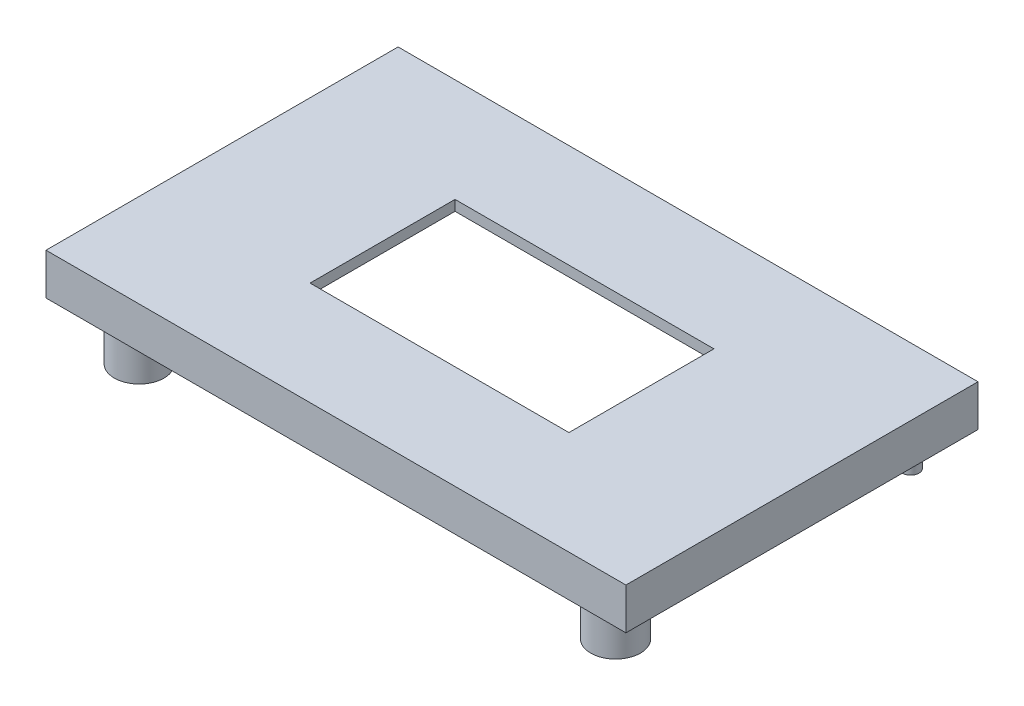
ISO-10303-21;
HEADER;
FILE_DESCRIPTION(('STEP AP214'),'2;1');
FILE_NAME('part.step','',(''),(''),'','','');
FILE_SCHEMA(('AUTOMOTIVE_DESIGN { 1 0 10303 214 1 1 1 1 }'));
ENDSEC;
DATA;
#1=APPLICATION_CONTEXT('core data for automotive mechanical design processes');
#2=APPLICATION_PROTOCOL_DEFINITION('international standard','automotive_design',2000,#1);
#3=PRODUCT_CONTEXT('',#1,'mechanical');
#4=PRODUCT('Part','Part','',(#3));
#5=PRODUCT_RELATED_PRODUCT_CATEGORY('part','',(#4));
#6=PRODUCT_DEFINITION_FORMATION('','',#4);
#7=PRODUCT_DEFINITION_CONTEXT('part definition',#1,'design');
#8=PRODUCT_DEFINITION('design','',#6,#7);
#9=PRODUCT_DEFINITION_SHAPE('','',#8);
#10=(LENGTH_UNIT() NAMED_UNIT(*) SI_UNIT(.MILLI.,.METRE.));
#11=(NAMED_UNIT(*) PLANE_ANGLE_UNIT() SI_UNIT($,.RADIAN.));
#12=(NAMED_UNIT(*) SI_UNIT($,.STERADIAN.) SOLID_ANGLE_UNIT());
#13=UNCERTAINTY_MEASURE_WITH_UNIT(LENGTH_MEASURE(1.E-05),#10,'distance_accuracy_value','');
#14=(GEOMETRIC_REPRESENTATION_CONTEXT(3) GLOBAL_UNCERTAINTY_ASSIGNED_CONTEXT((#13)) GLOBAL_UNIT_ASSIGNED_CONTEXT((#10,
#11,#12)) REPRESENTATION_CONTEXT('',''));
#15=CARTESIAN_POINT('',(0.,0.,0.));
#16=DIRECTION('',(0.,0.,1.));
#17=DIRECTION('',(1.,0.,0.));
#18=AXIS2_PLACEMENT_3D('',#15,#16,#17);
#19=CARTESIAN_POINT('',(-21.168,3.,0.));
#20=DIRECTION('',(1.,0.,0.));
#21=DIRECTION('',(0.,0.,-1.));
#22=AXIS2_PLACEMENT_3D('',#19,#20,#21);
#23=PLANE('',#22);
#24=DIRECTION('',(0.,0.,1.));
#25=VECTOR('',#24,1.);
#26=CARTESIAN_POINT('',(-21.168,0.,0.));
#27=LINE('',#26,#25);
#28=CARTESIAN_POINT('',(-21.168,0.,-11.672));
#29=VERTEX_POINT('',#28);
#30=CARTESIAN_POINT('',(-21.168,0.,22.328));
#31=VERTEX_POINT('',#30);
#32=EDGE_CURVE('E107',#29,#31,#27,.T.);
#33=ORIENTED_EDGE('',*,*,#32,.T.);
#34=DIRECTION('',(0.,-1.,0.));
#35=VECTOR('',#34,1.);
#36=CARTESIAN_POINT('',(-21.168,3.,22.328));
#37=LINE('',#36,#35);
#38=CARTESIAN_POINT('',(-21.168,4.,22.328));
#39=VERTEX_POINT('',#38);
#40=EDGE_CURVE('E117',#39,#31,#37,.T.);
#41=ORIENTED_EDGE('',*,*,#40,.F.);
#42=DIRECTION('',(0.,0.,1.));
#43=VECTOR('',#42,1.);
#44=CARTESIAN_POINT('',(-21.168,4.,-9.67200000000001));
#45=LINE('',#44,#43);
#46=CARTESIAN_POINT('',(-21.168,4.,-11.672));
#47=VERTEX_POINT('',#46);
#48=EDGE_CURVE('E269',#47,#39,#45,.T.);
#49=ORIENTED_EDGE('',*,*,#48,.F.);
#50=DIRECTION('',(0.,1.,0.));
#51=VECTOR('',#50,1.);
#52=CARTESIAN_POINT('',(-21.168,0.,-11.672));
#53=LINE('',#52,#51);
#54=EDGE_CURVE('E131',#29,#47,#53,.T.);
#55=ORIENTED_EDGE('',*,*,#54,.F.);
#56=EDGE_LOOP('',(#33,#41,#49,#55));
#57=FACE_BOUND('',#56,.T.);
#58=ADVANCED_FACE('F48',(#57),#23,.F.);
#59=CARTESIAN_POINT('',(0.,3.,22.328));
#60=DIRECTION('',(0.,0.,-1.));
#61=DIRECTION('',(-1.,0.,0.));
#62=AXIS2_PLACEMENT_3D('',#59,#60,#61);
#63=PLANE('',#62);
#64=DIRECTION('',(1.,0.,0.));
#65=VECTOR('',#64,1.);
#66=CARTESIAN_POINT('',(0.,0.,22.328));
#67=LINE('',#66,#65);
#68=CARTESIAN_POINT('',(34.832,0.,22.328));
#69=VERTEX_POINT('',#68);
#70=EDGE_CURVE('E101',#31,#69,#67,.T.);
#71=ORIENTED_EDGE('',*,*,#70,.T.);
#72=DIRECTION('',(0.,-1.,0.));
#73=VECTOR('',#72,1.);
#74=CARTESIAN_POINT('',(34.832,3.,22.328));
#75=LINE('',#74,#73);
#76=CARTESIAN_POINT('',(34.832,4.,22.328));
#77=VERTEX_POINT('',#76);
#78=EDGE_CURVE('E127',#77,#69,#75,.T.);
#79=ORIENTED_EDGE('',*,*,#78,.F.);
#80=DIRECTION('',(1.,0.,0.));
#81=VECTOR('',#80,1.);
#82=CARTESIAN_POINT('',(-21.168,4.,22.328));
#83=LINE('',#82,#81);
#84=EDGE_CURVE('E121',#39,#77,#83,.T.);
#85=ORIENTED_EDGE('',*,*,#84,.F.);
#86=ORIENTED_EDGE('',*,*,#40,.T.);
#87=EDGE_LOOP('',(#71,#79,#85,#86));
#88=FACE_BOUND('',#87,.T.);
#89=ADVANCED_FACE('F118',(#88),#63,.F.);
#90=CARTESIAN_POINT('',(-20.168,3.,0.));
#91=DIRECTION('',(1.,0.,0.));
#92=DIRECTION('',(0.,0.,-1.));
#93=AXIS2_PLACEMENT_3D('',#90,#91,#92);
#94=PLANE('',#93);
#95=DIRECTION('',(0.,0.,1.));
#96=VECTOR('',#95,1.);
#97=CARTESIAN_POINT('',(-20.168,0.,0.));
#98=LINE('',#97,#96);
#99=CARTESIAN_POINT('',(-20.168,0.,-8.67200000000001));
#100=VERTEX_POINT('',#99);
#101=CARTESIAN_POINT('',(-20.168,0.,14.328));
#102=VERTEX_POINT('',#101);
#103=EDGE_CURVE('E202',#100,#102,#98,.T.);
#104=ORIENTED_EDGE('',*,*,#103,.F.);
#105=DIRECTION('',(0.,-1.,0.));
#106=VECTOR('',#105,1.);
#107=CARTESIAN_POINT('',(-20.168,3.,-8.67200000000001));
#108=LINE('',#107,#106);
#109=CARTESIAN_POINT('',(-20.168,3.,-8.67200000000001));
#110=VERTEX_POINT('',#109);
#111=EDGE_CURVE('E149',#110,#100,#108,.T.);
#112=ORIENTED_EDGE('',*,*,#111,.F.);
#113=DIRECTION('',(0.,0.,1.));
#114=VECTOR('',#113,1.);
#115=CARTESIAN_POINT('',(-20.168,3.,0.));
#116=LINE('',#115,#114);
#117=CARTESIAN_POINT('',(-20.168,3.,14.328));
#118=VERTEX_POINT('',#117);
#119=EDGE_CURVE('E147',#110,#118,#116,.T.);
#120=ORIENTED_EDGE('',*,*,#119,.T.);
#121=DIRECTION('',(0.,-1.,0.));
#122=VECTOR('',#121,1.);
#123=CARTESIAN_POINT('',(-20.168,3.,14.328));
#124=LINE('',#123,#122);
#125=EDGE_CURVE('E151',#118,#102,#124,.T.);
#126=ORIENTED_EDGE('',*,*,#125,.T.);
#127=EDGE_LOOP('',(#104,#112,#120,#126));
#128=FACE_BOUND('',#127,.T.);
#129=ADVANCED_FACE('F50',(#128),#94,.T.);
#130=CARTESIAN_POINT('',(0.,3.,-8.67200000000001));
#131=DIRECTION('',(0.,0.,-1.));
#132=DIRECTION('',(-1.,0.,0.));
#133=AXIS2_PLACEMENT_3D('',#130,#131,#132);
#134=PLANE('',#133);
#135=DIRECTION('',(1.,0.,0.));
#136=VECTOR('',#135,1.);
#137=CARTESIAN_POINT('',(0.,0.,-8.67200000000001));
#138=LINE('',#137,#136);
#139=CARTESIAN_POINT('',(33.832,0.,-8.67200000000001));
#140=VERTEX_POINT('',#139);
#141=EDGE_CURVE('E206',#100,#140,#138,.T.);
#142=ORIENTED_EDGE('',*,*,#141,.T.);
#143=DIRECTION('',(0.,-1.,0.));
#144=VECTOR('',#143,1.);
#145=CARTESIAN_POINT('',(33.832,3.,-8.67200000000001));
#146=LINE('',#145,#144);
#147=CARTESIAN_POINT('',(33.832,3.,-8.67200000000001));
#148=VERTEX_POINT('',#147);
#149=EDGE_CURVE('E170',#148,#140,#146,.T.);
#150=ORIENTED_EDGE('',*,*,#149,.F.);
#151=DIRECTION('',(1.,0.,0.));
#152=VECTOR('',#151,1.);
#153=CARTESIAN_POINT('',(0.,3.,-8.67200000000001));
#154=LINE('',#153,#152);
#155=EDGE_CURVE('E259',#110,#148,#154,.T.);
#156=ORIENTED_EDGE('',*,*,#155,.F.);
#157=ORIENTED_EDGE('',*,*,#111,.T.);
#158=EDGE_LOOP('',(#142,#150,#156,#157));
#159=FACE_BOUND('',#158,.T.);
#160=ADVANCED_FACE('F388',(#159),#134,.F.);
#161=CARTESIAN_POINT('',(33.832,3.,0.));
#162=DIRECTION('',(1.,0.,0.));
#163=DIRECTION('',(0.,0.,-1.));
#164=AXIS2_PLACEMENT_3D('',#161,#162,#163);
#165=PLANE('',#164);
#166=DIRECTION('',(0.,0.,1.));
#167=VECTOR('',#166,1.);
#168=CARTESIAN_POINT('',(33.832,0.,0.));
#169=LINE('',#168,#167);
#170=CARTESIAN_POINT('',(33.832,0.,14.328));
#171=VERTEX_POINT('',#170);
#172=EDGE_CURVE('E235',#140,#171,#169,.T.);
#173=ORIENTED_EDGE('',*,*,#172,.T.);
#174=DIRECTION('',(0.,-1.,0.));
#175=VECTOR('',#174,1.);
#176=CARTESIAN_POINT('',(33.832,3.,14.328));
#177=LINE('',#176,#175);
#178=CARTESIAN_POINT('',(33.832,3.,14.328));
#179=VERTEX_POINT('',#178);
#180=EDGE_CURVE('E167',#179,#171,#177,.T.);
#181=ORIENTED_EDGE('',*,*,#180,.F.);
#182=DIRECTION('',(0.,0.,1.));
#183=VECTOR('',#182,1.);
#184=CARTESIAN_POINT('',(33.832,3.,0.));
#185=LINE('',#184,#183);
#186=EDGE_CURVE('E255',#148,#179,#185,.T.);
#187=ORIENTED_EDGE('',*,*,#186,.F.);
#188=ORIENTED_EDGE('',*,*,#149,.T.);
#189=EDGE_LOOP('',(#173,#181,#187,#188));
#190=FACE_BOUND('',#189,.T.);
#191=ADVANCED_FACE('F386',(#190),#165,.F.);
#192=CARTESIAN_POINT('',(0.,3.,14.328));
#193=DIRECTION('',(0.,0.,-1.));
#194=DIRECTION('',(-1.,0.,0.));
#195=AXIS2_PLACEMENT_3D('',#192,#193,#194);
#196=PLANE('',#195);
#197=DIRECTION('',(1.,0.,0.));
#198=VECTOR('',#197,1.);
#199=CARTESIAN_POINT('',(0.,0.,14.328));
#200=LINE('',#199,#198);
#201=CARTESIAN_POINT('',(20.832,0.,14.328));
#202=VERTEX_POINT('',#201);
#203=EDGE_CURVE('E141',#202,#171,#200,.T.);
#204=ORIENTED_EDGE('',*,*,#203,.F.);
#205=DIRECTION('',(0.,-1.,0.));
#206=VECTOR('',#205,1.);
#207=CARTESIAN_POINT('',(20.832,3.,14.328));
#208=LINE('',#207,#206);
#209=CARTESIAN_POINT('',(20.832,3.,14.328));
#210=VERTEX_POINT('',#209);
#211=EDGE_CURVE('E164',#210,#202,#208,.T.);
#212=ORIENTED_EDGE('',*,*,#211,.F.);
#213=DIRECTION('',(1.,0.,0.));
#214=VECTOR('',#213,1.);
#215=CARTESIAN_POINT('',(0.,3.,14.328));
#216=LINE('',#215,#214);
#217=EDGE_CURVE('E251',#210,#179,#216,.T.);
#218=ORIENTED_EDGE('',*,*,#217,.T.);
#219=ORIENTED_EDGE('',*,*,#180,.T.);
#220=EDGE_LOOP('',(#204,#212,#218,#219));
#221=FACE_BOUND('',#220,.T.);
#222=ADVANCED_FACE('F375',(#221),#196,.T.);
#223=CARTESIAN_POINT('',(20.832,3.,0.));
#224=DIRECTION('',(1.,0.,0.));
#225=DIRECTION('',(0.,0.,-1.));
#226=AXIS2_PLACEMENT_3D('',#223,#224,#225);
#227=PLANE('',#226);
#228=DIRECTION('',(0.,0.,1.));
#229=VECTOR('',#228,1.);
#230=CARTESIAN_POINT('',(20.832,0.,0.));
#231=LINE('',#230,#229);
#232=CARTESIAN_POINT('',(20.832,0.,21.328));
#233=VERTEX_POINT('',#232);
#234=EDGE_CURVE('E227',#202,#233,#231,.T.);
#235=ORIENTED_EDGE('',*,*,#234,.T.);
#236=DIRECTION('',(0.,-1.,0.));
#237=VECTOR('',#236,1.);
#238=CARTESIAN_POINT('',(20.832,3.,21.328));
#239=LINE('',#238,#237);
#240=CARTESIAN_POINT('',(20.832,3.,21.328));
#241=VERTEX_POINT('',#240);
#242=EDGE_CURVE('E161',#241,#233,#239,.T.);
#243=ORIENTED_EDGE('',*,*,#242,.F.);
#244=DIRECTION('',(0.,0.,1.));
#245=VECTOR('',#244,1.);
#246=CARTESIAN_POINT('',(20.832,3.,0.));
#247=LINE('',#246,#245);
#248=EDGE_CURVE('E247',#210,#241,#247,.T.);
#249=ORIENTED_EDGE('',*,*,#248,.F.);
#250=ORIENTED_EDGE('',*,*,#211,.T.);
#251=EDGE_LOOP('',(#235,#243,#249,#250));
#252=FACE_BOUND('',#251,.T.);
#253=ADVANCED_FACE('F381',(#252),#227,.F.);
#254=CARTESIAN_POINT('',(0.,3.,21.328));
#255=DIRECTION('',(0.,0.,-1.));
#256=DIRECTION('',(-1.,0.,0.));
#257=AXIS2_PLACEMENT_3D('',#254,#255,#256);
#258=PLANE('',#257);
#259=DIRECTION('',(1.,0.,0.));
#260=VECTOR('',#259,1.);
#261=CARTESIAN_POINT('',(0.,0.,21.328));
#262=LINE('',#261,#260);
#263=CARTESIAN_POINT('',(-7.16800000000001,0.,21.328));
#264=VERTEX_POINT('',#263);
#265=EDGE_CURVE('E224',#264,#233,#262,.T.);
#266=ORIENTED_EDGE('',*,*,#265,.F.);
#267=DIRECTION('',(0.,-1.,0.));
#268=VECTOR('',#267,1.);
#269=CARTESIAN_POINT('',(-7.16800000000001,3.,21.328));
#270=LINE('',#269,#268);
#271=CARTESIAN_POINT('',(-7.16800000000001,3.,21.328));
#272=VERTEX_POINT('',#271);
#273=EDGE_CURVE('E158',#272,#264,#270,.T.);
#274=ORIENTED_EDGE('',*,*,#273,.F.);
#275=DIRECTION('',(1.,0.,0.));
#276=VECTOR('',#275,1.);
#277=CARTESIAN_POINT('',(0.,3.,21.328));
#278=LINE('',#277,#276);
#279=EDGE_CURVE('E243',#272,#241,#278,.T.);
#280=ORIENTED_EDGE('',*,*,#279,.T.);
#281=ORIENTED_EDGE('',*,*,#242,.T.);
#282=EDGE_LOOP('',(#266,#274,#280,#281));
#283=FACE_BOUND('',#282,.T.);
#284=ADVANCED_FACE('F378',(#283),#258,.T.);
#285=CARTESIAN_POINT('',(-7.16800000000001,3.,0.));
#286=DIRECTION('',(1.,0.,0.));
#287=DIRECTION('',(0.,0.,-1.));
#288=AXIS2_PLACEMENT_3D('',#285,#286,#287);
#289=PLANE('',#288);
#290=DIRECTION('',(0.,0.,1.));
#291=VECTOR('',#290,1.);
#292=CARTESIAN_POINT('',(-7.16800000000001,0.,0.));
#293=LINE('',#292,#291);
#294=CARTESIAN_POINT('',(-7.16800000000001,0.,14.328));
#295=VERTEX_POINT('',#294);
#296=EDGE_CURVE('E139',#295,#264,#293,.T.);
#297=ORIENTED_EDGE('',*,*,#296,.F.);
#298=DIRECTION('',(0.,-1.,0.));
#299=VECTOR('',#298,1.);
#300=CARTESIAN_POINT('',(-7.16800000000001,3.,14.328));
#301=LINE('',#300,#299);
#302=CARTESIAN_POINT('',(-7.16800000000001,3.,14.328));
#303=VERTEX_POINT('',#302);
#304=EDGE_CURVE('E154',#303,#295,#301,.T.);
#305=ORIENTED_EDGE('',*,*,#304,.F.);
#306=DIRECTION('',(0.,0.,1.));
#307=VECTOR('',#306,1.);
#308=CARTESIAN_POINT('',(-7.16800000000001,3.,0.));
#309=LINE('',#308,#307);
#310=EDGE_CURVE('E65',#303,#272,#309,.T.);
#311=ORIENTED_EDGE('',*,*,#310,.T.);
#312=ORIENTED_EDGE('',*,*,#273,.T.);
#313=EDGE_LOOP('',(#297,#305,#311,#312));
#314=FACE_BOUND('',#313,.T.);
#315=ADVANCED_FACE('F220',(#314),#289,.T.);
#316=EDGE_CURVE('E133',#102,#295,#200,.T.);
#317=ORIENTED_EDGE('',*,*,#316,.F.);
#318=ORIENTED_EDGE('',*,*,#125,.F.);
#319=EDGE_CURVE('E155',#118,#303,#216,.T.);
#320=ORIENTED_EDGE('',*,*,#319,.T.);
#321=ORIENTED_EDGE('',*,*,#304,.T.);
#322=EDGE_LOOP('',(#317,#318,#320,#321));
#323=FACE_BOUND('',#322,.T.);
#324=ADVANCED_FACE('F214',(#323),#196,.T.);
#325=CARTESIAN_POINT('',(34.832,3.,0.));
#326=DIRECTION('',(1.,0.,0.));
#327=DIRECTION('',(0.,0.,-1.));
#328=AXIS2_PLACEMENT_3D('',#325,#326,#327);
#329=PLANE('',#328);
#330=DIRECTION('',(0.,0.,1.));
#331=VECTOR('',#330,1.);
#332=CARTESIAN_POINT('',(34.832,0.,0.));
#333=LINE('',#332,#331);
#334=CARTESIAN_POINT('',(34.832,0.,-11.672));
#335=VERTEX_POINT('',#334);
#336=EDGE_CURVE('E110',#335,#69,#333,.T.);
#337=ORIENTED_EDGE('',*,*,#336,.F.);
#338=DIRECTION('',(0.,1.,0.));
#339=VECTOR('',#338,1.);
#340=CARTESIAN_POINT('',(34.832,0.,-11.672));
#341=LINE('',#340,#339);
#342=CARTESIAN_POINT('',(34.832,4.,-11.672));
#343=VERTEX_POINT('',#342);
#344=EDGE_CURVE('E328',#335,#343,#341,.T.);
#345=ORIENTED_EDGE('',*,*,#344,.T.);
#346=DIRECTION('',(0.,0.,-1.));
#347=VECTOR('',#346,1.);
#348=CARTESIAN_POINT('',(34.832,4.,-9.67200000000001));
#349=LINE('',#348,#347);
#350=EDGE_CURVE('E210',#77,#343,#349,.T.);
#351=ORIENTED_EDGE('',*,*,#350,.F.);
#352=ORIENTED_EDGE('',*,*,#78,.T.);
#353=EDGE_LOOP('',(#337,#345,#351,#352));
#354=FACE_BOUND('',#353,.T.);
#355=ADVANCED_FACE('F192',(#354),#329,.T.);
#356=CARTESIAN_POINT('',(0.,0.,0.));
#357=DIRECTION('',(0.,1.,0.));
#358=DIRECTION('',(0.,0.,1.));
#359=AXIS2_PLACEMENT_3D('',#356,#357,#358);
#360=PLANE('',#359);
#361=CARTESIAN_POINT('',(-16.168,0.,-10.172));
#362=DIRECTION('',(0.,1.,0.));
#363=DIRECTION('',(0.,0.,1.));
#364=AXIS2_PLACEMENT_3D('',#361,#362,#363);
#365=CIRCLE('',#364,0.799999999999999);
#366=CARTESIAN_POINT('',(-16.168,0.,-9.37200000000001));
#367=VERTEX_POINT('',#366);
#368=EDGE_CURVE('E11',#367,#367,#365,.F.);
#369=ORIENTED_EDGE('',*,*,#368,.F.);
#370=EDGE_LOOP('',(#369));
#371=FACE_BOUND('',#370,.T.);
#372=CARTESIAN_POINT('',(29.832,0.,-10.172));
#373=DIRECTION('',(0.,1.,0.));
#374=DIRECTION('',(0.,0.,1.));
#375=AXIS2_PLACEMENT_3D('',#372,#373,#374);
#376=CIRCLE('',#375,0.799999999999999);
#377=CARTESIAN_POINT('',(29.832,0.,-9.37200000000001));
#378=VERTEX_POINT('',#377);
#379=EDGE_CURVE('E58',#378,#378,#376,.F.);
#380=ORIENTED_EDGE('',*,*,#379,.F.);
#381=EDGE_LOOP('',(#380));
#382=FACE_BOUND('',#381,.T.);
#383=CARTESIAN_POINT('',(29.832,0.,18.328));
#384=DIRECTION('',(0.,1.,0.));
#385=DIRECTION('',(0.,0.,1.));
#386=AXIS2_PLACEMENT_3D('',#383,#384,#385);
#387=CIRCLE('',#386,2.4);
#388=CARTESIAN_POINT('',(29.832,0.,20.728));
#389=VERTEX_POINT('',#388);
#390=EDGE_CURVE('E178',#389,#389,#387,.F.);
#391=ORIENTED_EDGE('',*,*,#390,.F.);
#392=EDGE_LOOP('',(#391));
#393=FACE_BOUND('',#392,.T.);
#394=CARTESIAN_POINT('',(-16.168,0.,18.328));
#395=DIRECTION('',(0.,1.,0.));
#396=DIRECTION('',(0.,0.,1.));
#397=AXIS2_PLACEMENT_3D('',#394,#395,#396);
#398=CIRCLE('',#397,2.4);
#399=CARTESIAN_POINT('',(-16.168,0.,20.728));
#400=VERTEX_POINT('',#399);
#401=EDGE_CURVE('E126',#400,#400,#398,.F.);
#402=ORIENTED_EDGE('',*,*,#401,.F.);
#403=EDGE_LOOP('',(#402));
#404=FACE_BOUND('',#403,.T.);
#405=ORIENTED_EDGE('',*,*,#103,.T.);
#406=ORIENTED_EDGE('',*,*,#316,.T.);
#407=ORIENTED_EDGE('',*,*,#296,.T.);
#408=ORIENTED_EDGE('',*,*,#265,.T.);
#409=ORIENTED_EDGE('',*,*,#234,.F.);
#410=ORIENTED_EDGE('',*,*,#203,.T.);
#411=ORIENTED_EDGE('',*,*,#172,.F.);
#412=ORIENTED_EDGE('',*,*,#141,.F.);
#413=EDGE_LOOP('',(#405,#406,#407,#408,#409,#410,#411,#412));
#414=FACE_BOUND('',#413,.T.);
#415=ORIENTED_EDGE('',*,*,#32,.F.);
#416=DIRECTION('',(1.,0.,0.));
#417=VECTOR('',#416,1.);
#418=CARTESIAN_POINT('',(-21.168,0.,-11.672));
#419=LINE('',#418,#417);
#420=EDGE_CURVE('E332',#29,#335,#419,.T.);
#421=ORIENTED_EDGE('',*,*,#420,.T.);
#422=ORIENTED_EDGE('',*,*,#336,.T.);
#423=ORIENTED_EDGE('',*,*,#70,.F.);
#424=EDGE_LOOP('',(#415,#421,#422,#423));
#425=FACE_BOUND('',#424,.T.);
#426=ADVANCED_FACE('F103',(#371,#382,#393,#404,#414,#425),#360,.F.);
#427=CARTESIAN_POINT('',(0.,4.,0.));
#428=DIRECTION('',(0.,1.,0.));
#429=DIRECTION('',(0.,0.,1.));
#430=AXIS2_PLACEMENT_3D('',#427,#428,#429);
#431=PLANE('',#430);
#432=ORIENTED_EDGE('',*,*,#48,.T.);
#433=ORIENTED_EDGE('',*,*,#84,.T.);
#434=ORIENTED_EDGE('',*,*,#350,.T.);
#435=DIRECTION('',(1.,0.,0.));
#436=VECTOR('',#435,1.);
#437=CARTESIAN_POINT('',(-21.168,4.,-11.672));
#438=LINE('',#437,#436);
#439=EDGE_CURVE('E333',#47,#343,#438,.T.);
#440=ORIENTED_EDGE('',*,*,#439,.F.);
#441=EDGE_LOOP('',(#432,#433,#434,#440));
#442=FACE_BOUND('',#441,.T.);
#443=DIRECTION('',(1.,0.,0.));
#444=VECTOR('',#443,1.);
#445=CARTESIAN_POINT('',(19.332,4.,12.328));
#446=LINE('',#445,#444);
#447=CARTESIAN_POINT('',(-5.66800000000001,4.,12.328));
#448=VERTEX_POINT('',#447);
#449=CARTESIAN_POINT('',(19.332,4.,12.328));
#450=VERTEX_POINT('',#449);
#451=EDGE_CURVE('E312',#448,#450,#446,.T.);
#452=ORIENTED_EDGE('',*,*,#451,.F.);
#453=DIRECTION('',(0.,0.,1.));
#454=VECTOR('',#453,1.);
#455=CARTESIAN_POINT('',(-5.66800000000001,4.,12.328));
#456=LINE('',#455,#454);
#457=CARTESIAN_POINT('',(-5.66800000000001,4.,-1.672));
#458=VERTEX_POINT('',#457);
#459=EDGE_CURVE('E291',#458,#448,#456,.T.);
#460=ORIENTED_EDGE('',*,*,#459,.F.);
#461=DIRECTION('',(-1.,0.,0.));
#462=VECTOR('',#461,1.);
#463=CARTESIAN_POINT('',(19.332,4.,-1.67200000000001));
#464=LINE('',#463,#462);
#465=CARTESIAN_POINT('',(19.332,4.,-1.67200000000001));
#466=VERTEX_POINT('',#465);
#467=EDGE_CURVE('E286',#466,#458,#464,.T.);
#468=ORIENTED_EDGE('',*,*,#467,.F.);
#469=DIRECTION('',(0.,0.,-1.));
#470=VECTOR('',#469,1.);
#471=CARTESIAN_POINT('',(19.332,4.,12.328));
#472=LINE('',#471,#470);
#473=EDGE_CURVE('E308',#450,#466,#472,.T.);
#474=ORIENTED_EDGE('',*,*,#473,.F.);
#475=EDGE_LOOP('',(#452,#460,#468,#474));
#476=FACE_BOUND('',#475,.T.);
#477=ADVANCED_FACE('F191',(#442,#476),#431,.T.);
#478=CARTESIAN_POINT('',(0.,3.,0.));
#479=DIRECTION('',(0.,1.,0.));
#480=DIRECTION('',(0.,0.,1.));
#481=AXIS2_PLACEMENT_3D('',#478,#479,#480);
#482=PLANE('',#481);
#483=ORIENTED_EDGE('',*,*,#119,.F.);
#484=ORIENTED_EDGE('',*,*,#155,.T.);
#485=ORIENTED_EDGE('',*,*,#186,.T.);
#486=ORIENTED_EDGE('',*,*,#217,.F.);
#487=ORIENTED_EDGE('',*,*,#248,.T.);
#488=ORIENTED_EDGE('',*,*,#279,.F.);
#489=ORIENTED_EDGE('',*,*,#310,.F.);
#490=ORIENTED_EDGE('',*,*,#319,.F.);
#491=EDGE_LOOP('',(#483,#484,#485,#486,#487,#488,#489,#490));
#492=FACE_BOUND('',#491,.T.);
#493=DIRECTION('',(0.,0.,1.));
#494=VECTOR('',#493,1.);
#495=CARTESIAN_POINT('',(-5.66800000000001,3.,12.328));
#496=LINE('',#495,#494);
#497=CARTESIAN_POINT('',(-5.66800000000001,3.,-1.672));
#498=VERTEX_POINT('',#497);
#499=CARTESIAN_POINT('',(-5.66800000000001,3.,12.328));
#500=VERTEX_POINT('',#499);
#501=EDGE_CURVE('E300',#498,#500,#496,.T.);
#502=ORIENTED_EDGE('',*,*,#501,.T.);
#503=DIRECTION('',(1.,0.,0.));
#504=VECTOR('',#503,1.);
#505=CARTESIAN_POINT('',(19.332,3.,12.328));
#506=LINE('',#505,#504);
#507=CARTESIAN_POINT('',(19.332,3.,12.328));
#508=VERTEX_POINT('',#507);
#509=EDGE_CURVE('E296',#500,#508,#506,.T.);
#510=ORIENTED_EDGE('',*,*,#509,.T.);
#511=DIRECTION('',(0.,0.,-1.));
#512=VECTOR('',#511,1.);
#513=CARTESIAN_POINT('',(19.332,3.,12.328));
#514=LINE('',#513,#512);
#515=CARTESIAN_POINT('',(19.332,3.,-1.67200000000001));
#516=VERTEX_POINT('',#515);
#517=EDGE_CURVE('E292',#508,#516,#514,.T.);
#518=ORIENTED_EDGE('',*,*,#517,.T.);
#519=DIRECTION('',(-1.,0.,0.));
#520=VECTOR('',#519,1.);
#521=CARTESIAN_POINT('',(19.332,3.,-1.67200000000001));
#522=LINE('',#521,#520);
#523=EDGE_CURVE('E287',#516,#498,#522,.T.);
#524=ORIENTED_EDGE('',*,*,#523,.T.);
#525=EDGE_LOOP('',(#502,#510,#518,#524));
#526=FACE_BOUND('',#525,.T.);
#527=ADVANCED_FACE('F451',(#492,#526),#482,.F.);
#528=CARTESIAN_POINT('',(-5.66800000000001,4.,12.328));
#529=DIRECTION('',(1.,0.,0.));
#530=DIRECTION('',(0.,0.,-1.));
#531=AXIS2_PLACEMENT_3D('',#528,#529,#530);
#532=PLANE('',#531);
#533=ORIENTED_EDGE('',*,*,#501,.F.);
#534=DIRECTION('',(0.,-1.,0.));
#535=VECTOR('',#534,1.);
#536=CARTESIAN_POINT('',(-5.66800000000001,4.,-1.672));
#537=LINE('',#536,#535);
#538=EDGE_CURVE('E283',#458,#498,#537,.T.);
#539=ORIENTED_EDGE('',*,*,#538,.F.);
#540=ORIENTED_EDGE('',*,*,#459,.T.);
#541=DIRECTION('',(0.,-1.,0.));
#542=VECTOR('',#541,1.);
#543=CARTESIAN_POINT('',(-5.66800000000001,4.,12.328));
#544=LINE('',#543,#542);
#545=EDGE_CURVE('E271',#448,#500,#544,.T.);
#546=ORIENTED_EDGE('',*,*,#545,.T.);
#547=EDGE_LOOP('',(#533,#539,#540,#546));
#548=FACE_BOUND('',#547,.T.);
#549=ADVANCED_FACE('F467',(#548),#532,.T.);
#550=CARTESIAN_POINT('',(19.332,4.,12.328));
#551=DIRECTION('',(0.,0.,-1.));
#552=DIRECTION('',(-1.,0.,0.));
#553=AXIS2_PLACEMENT_3D('',#550,#551,#552);
#554=PLANE('',#553);
#555=ORIENTED_EDGE('',*,*,#509,.F.);
#556=ORIENTED_EDGE('',*,*,#545,.F.);
#557=ORIENTED_EDGE('',*,*,#451,.T.);
#558=DIRECTION('',(0.,-1.,0.));
#559=VECTOR('',#558,1.);
#560=CARTESIAN_POINT('',(19.332,4.,12.328));
#561=LINE('',#560,#559);
#562=EDGE_CURVE('E275',#450,#508,#561,.T.);
#563=ORIENTED_EDGE('',*,*,#562,.T.);
#564=EDGE_LOOP('',(#555,#556,#557,#563));
#565=FACE_BOUND('',#564,.T.);
#566=ADVANCED_FACE('F460',(#565),#554,.T.);
#567=CARTESIAN_POINT('',(19.332,4.,12.328));
#568=DIRECTION('',(-1.,0.,0.));
#569=DIRECTION('',(0.,0.,1.));
#570=AXIS2_PLACEMENT_3D('',#567,#568,#569);
#571=PLANE('',#570);
#572=ORIENTED_EDGE('',*,*,#517,.F.);
#573=ORIENTED_EDGE('',*,*,#562,.F.);
#574=ORIENTED_EDGE('',*,*,#473,.T.);
#575=DIRECTION('',(0.,-1.,0.));
#576=VECTOR('',#575,1.);
#577=CARTESIAN_POINT('',(19.332,4.,-1.67200000000001));
#578=LINE('',#577,#576);
#579=EDGE_CURVE('E279',#466,#516,#578,.T.);
#580=ORIENTED_EDGE('',*,*,#579,.T.);
#581=EDGE_LOOP('',(#572,#573,#574,#580));
#582=FACE_BOUND('',#581,.T.);
#583=ADVANCED_FACE('F463',(#582),#571,.T.);
#584=CARTESIAN_POINT('',(19.332,4.,-1.67200000000001));
#585=DIRECTION('',(0.,0.,1.));
#586=DIRECTION('',(1.,0.,0.));
#587=AXIS2_PLACEMENT_3D('',#584,#585,#586);
#588=PLANE('',#587);
#589=ORIENTED_EDGE('',*,*,#523,.F.);
#590=ORIENTED_EDGE('',*,*,#579,.F.);
#591=ORIENTED_EDGE('',*,*,#467,.T.);
#592=ORIENTED_EDGE('',*,*,#538,.T.);
#593=EDGE_LOOP('',(#589,#590,#591,#592));
#594=FACE_BOUND('',#593,.T.);
#595=ADVANCED_FACE('F470',(#594),#588,.T.);
#596=CARTESIAN_POINT('',(-16.168,-5.,18.328));
#597=DIRECTION('',(0.,1.,0.));
#598=DIRECTION('',(0.,0.,1.));
#599=AXIS2_PLACEMENT_3D('',#596,#597,#598);
#600=CYLINDRICAL_SURFACE('',#599,2.4);
#601=CARTESIAN_POINT('',(-16.168,-5.,18.328));
#602=DIRECTION('',(0.,-1.,0.));
#603=DIRECTION('',(0.,0.,-1.));
#604=AXIS2_PLACEMENT_3D('',#601,#602,#603);
#605=CIRCLE('',#604,2.4);
#606=CARTESIAN_POINT('',(-16.168,-5.,15.928));
#607=VERTEX_POINT('',#606);
#608=EDGE_CURVE('E304',#607,#607,#605,.T.);
#609=ORIENTED_EDGE('',*,*,#608,.F.);
#610=EDGE_LOOP('',(#609));
#611=FACE_BOUND('',#610,.T.);
#612=ORIENTED_EDGE('',*,*,#401,.T.);
#613=EDGE_LOOP('',(#612));
#614=FACE_BOUND('',#613,.T.);
#615=ADVANCED_FACE('F472',(#611,#614),#600,.T.);
#616=CARTESIAN_POINT('',(-16.168,-5.,18.328));
#617=DIRECTION('',(0.,-1.,0.));
#618=DIRECTION('',(0.,0.,-1.));
#619=AXIS2_PLACEMENT_3D('',#616,#617,#618);
#620=PLANE('',#619);
#621=ORIENTED_EDGE('',*,*,#608,.T.);
#622=EDGE_LOOP('',(#621));
#623=FACE_BOUND('',#622,.T.);
#624=ADVANCED_FACE('F477',(#623),#620,.T.);
#625=CARTESIAN_POINT('',(29.832,-5.,18.328));
#626=DIRECTION('',(0.,1.,0.));
#627=DIRECTION('',(0.,0.,1.));
#628=AXIS2_PLACEMENT_3D('',#625,#626,#627);
#629=CYLINDRICAL_SURFACE('',#628,2.4);
#630=CARTESIAN_POINT('',(29.832,-5.,18.328));
#631=DIRECTION('',(0.,-1.,0.));
#632=DIRECTION('',(0.,0.,-1.));
#633=AXIS2_PLACEMENT_3D('',#630,#631,#632);
#634=CIRCLE('',#633,2.4);
#635=CARTESIAN_POINT('',(29.832,-5.,15.928));
#636=VERTEX_POINT('',#635);
#637=EDGE_CURVE('E322',#636,#636,#634,.T.);
#638=ORIENTED_EDGE('',*,*,#637,.F.);
#639=EDGE_LOOP('',(#638));
#640=FACE_BOUND('',#639,.T.);
#641=ORIENTED_EDGE('',*,*,#390,.T.);
#642=EDGE_LOOP('',(#641));
#643=FACE_BOUND('',#642,.T.);
#644=ADVANCED_FACE('F588',(#640,#643),#629,.T.);
#645=CARTESIAN_POINT('',(29.832,-5.,18.328));
#646=DIRECTION('',(0.,-1.,0.));
#647=DIRECTION('',(0.,0.,-1.));
#648=AXIS2_PLACEMENT_3D('',#645,#646,#647);
#649=PLANE('',#648);
#650=ORIENTED_EDGE('',*,*,#637,.T.);
#651=EDGE_LOOP('',(#650));
#652=FACE_BOUND('',#651,.T.);
#653=ADVANCED_FACE('F501',(#652),#649,.T.);
#654=CARTESIAN_POINT('',(-21.168,0.,-11.672));
#655=DIRECTION('',(0.,0.,1.));
#656=DIRECTION('',(1.,0.,0.));
#657=AXIS2_PLACEMENT_3D('',#654,#655,#656);
#658=PLANE('',#657);
#659=ORIENTED_EDGE('',*,*,#439,.T.);
#660=ORIENTED_EDGE('',*,*,#344,.F.);
#661=ORIENTED_EDGE('',*,*,#420,.F.);
#662=ORIENTED_EDGE('',*,*,#54,.T.);
#663=EDGE_LOOP('',(#659,#660,#661,#662));
#664=FACE_BOUND('',#663,.T.);
#665=ADVANCED_FACE('F446',(#664),#658,.F.);
#666=CARTESIAN_POINT('',(29.832,-5.,-10.172));
#667=DIRECTION('',(0.,1.,0.));
#668=DIRECTION('',(0.,0.,1.));
#669=AXIS2_PLACEMENT_3D('',#666,#667,#668);
#670=CYLINDRICAL_SURFACE('',#669,0.799999999999999);
#671=CARTESIAN_POINT('',(29.832,-5.,-10.172));
#672=DIRECTION('',(0.,-1.,0.));
#673=DIRECTION('',(0.,0.,-1.));
#674=AXIS2_PLACEMENT_3D('',#671,#672,#673);
#675=CIRCLE('',#674,0.799999999999999);
#676=CARTESIAN_POINT('',(29.832,-5.,-10.972));
#677=VERTEX_POINT('',#676);
#678=EDGE_CURVE('E337',#677,#677,#675,.T.);
#679=ORIENTED_EDGE('',*,*,#678,.F.);
#680=EDGE_LOOP('',(#679));
#681=FACE_BOUND('',#680,.T.);
#682=ORIENTED_EDGE('',*,*,#379,.T.);
#683=EDGE_LOOP('',(#682));
#684=FACE_BOUND('',#683,.T.);
#685=ADVANCED_FACE('F187',(#681,#684),#670,.T.);
#686=CARTESIAN_POINT('',(29.832,-5.,-10.172));
#687=DIRECTION('',(0.,-1.,0.));
#688=DIRECTION('',(0.,0.,-1.));
#689=AXIS2_PLACEMENT_3D('',#686,#687,#688);
#690=PLANE('',#689);
#691=ORIENTED_EDGE('',*,*,#678,.T.);
#692=EDGE_LOOP('',(#691));
#693=FACE_BOUND('',#692,.T.);
#694=ADVANCED_FACE('F353',(#693),#690,.T.);
#695=CARTESIAN_POINT('',(-16.168,-5.,-10.172));
#696=DIRECTION('',(0.,1.,0.));
#697=DIRECTION('',(0.,0.,1.));
#698=AXIS2_PLACEMENT_3D('',#695,#696,#697);
#699=CYLINDRICAL_SURFACE('',#698,0.799999999999999);
#700=CARTESIAN_POINT('',(-16.168,-5.,-10.172));
#701=DIRECTION('',(0.,-1.,0.));
#702=DIRECTION('',(0.,0.,-1.));
#703=AXIS2_PLACEMENT_3D('',#700,#701,#702);
#704=CIRCLE('',#703,0.799999999999999);
#705=CARTESIAN_POINT('',(-16.168,-5.,-10.972));
#706=VERTEX_POINT('',#705);
#707=EDGE_CURVE('E343',#706,#706,#704,.T.);
#708=ORIENTED_EDGE('',*,*,#707,.F.);
#709=EDGE_LOOP('',(#708));
#710=FACE_BOUND('',#709,.T.);
#711=ORIENTED_EDGE('',*,*,#368,.T.);
#712=EDGE_LOOP('',(#711));
#713=FACE_BOUND('',#712,.T.);
#714=ADVANCED_FACE('F350',(#710,#713),#699,.T.);
#715=CARTESIAN_POINT('',(-16.168,-5.,-10.172));
#716=DIRECTION('',(0.,-1.,0.));
#717=DIRECTION('',(0.,0.,-1.));
#718=AXIS2_PLACEMENT_3D('',#715,#716,#717);
#719=PLANE('',#718);
#720=ORIENTED_EDGE('',*,*,#707,.T.);
#721=EDGE_LOOP('',(#720));
#722=FACE_BOUND('',#721,.T.);
#723=ADVANCED_FACE('F348',(#722),#719,.T.);
#724=CLOSED_SHELL('',(#58,#89,#129,#160,#191,#222,#253,#284,#315,#324,#355,#426,#477,#527,#549,
#566,#583,#595,#615,#624,#644,#653,#665,#685,#694,#714,#723));
#725=MANIFOLD_SOLID_BREP('B2',#724);
#726=ADVANCED_BREP_SHAPE_REPRESENTATION('',(#18,#725),#14);
#727=SHAPE_DEFINITION_REPRESENTATION(#9,#726);
ENDSEC;
END-ISO-10303-21;
